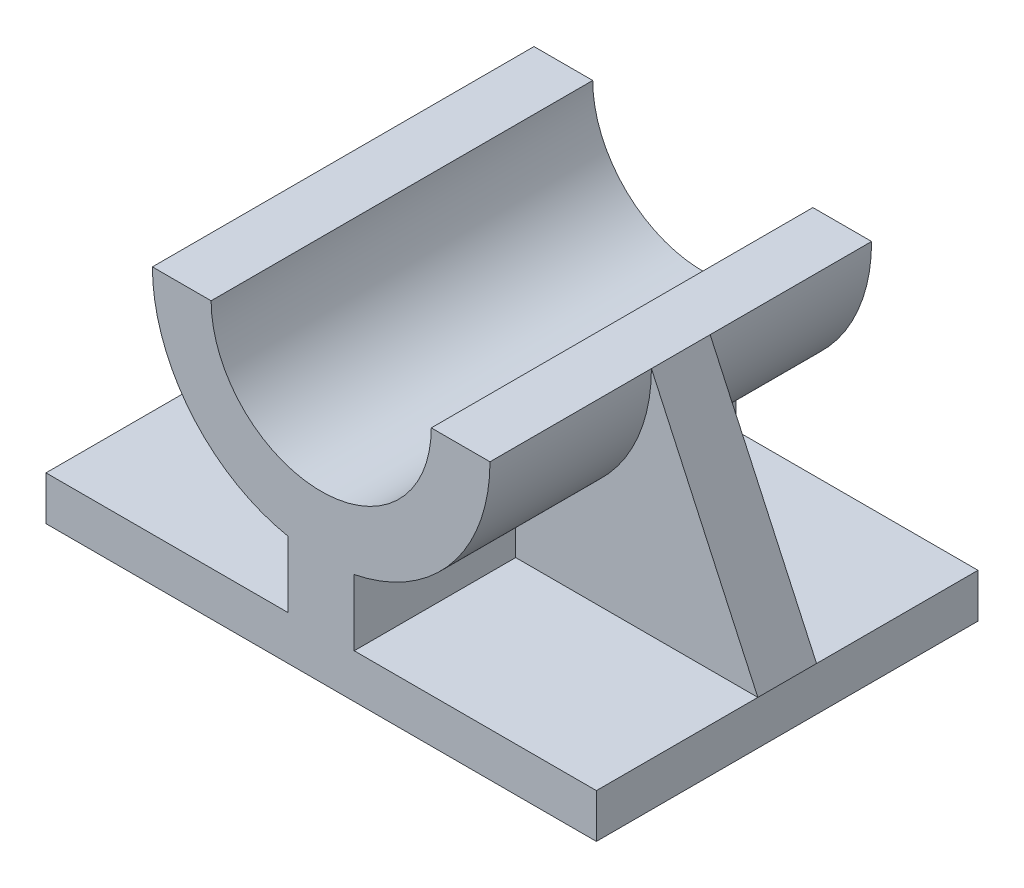
ISO-10303-21;
HEADER;
FILE_DESCRIPTION(('STEP AP214'),'2;1');
FILE_NAME('part.step','',(''),(''),'','','');
FILE_SCHEMA(('AUTOMOTIVE_DESIGN { 1 0 10303 214 1 1 1 1 }'));
ENDSEC;
DATA;
#1=APPLICATION_CONTEXT('core data for automotive mechanical design processes');
#2=APPLICATION_PROTOCOL_DEFINITION('international standard','automotive_design',2000,#1);
#3=PRODUCT_CONTEXT('',#1,'mechanical');
#4=PRODUCT('Part','Part','',(#3));
#5=PRODUCT_RELATED_PRODUCT_CATEGORY('part','',(#4));
#6=PRODUCT_DEFINITION_FORMATION('','',#4);
#7=PRODUCT_DEFINITION_CONTEXT('part definition',#1,'design');
#8=PRODUCT_DEFINITION('design','',#6,#7);
#9=PRODUCT_DEFINITION_SHAPE('','',#8);
#10=(LENGTH_UNIT() NAMED_UNIT(*) SI_UNIT(.MILLI.,.METRE.));
#11=(NAMED_UNIT(*) PLANE_ANGLE_UNIT() SI_UNIT($,.RADIAN.));
#12=(NAMED_UNIT(*) SI_UNIT($,.STERADIAN.) SOLID_ANGLE_UNIT());
#13=UNCERTAINTY_MEASURE_WITH_UNIT(LENGTH_MEASURE(1.E-05),#10,'distance_accuracy_value','');
#14=(GEOMETRIC_REPRESENTATION_CONTEXT(3) GLOBAL_UNCERTAINTY_ASSIGNED_CONTEXT((#13)) GLOBAL_UNIT_ASSIGNED_CONTEXT((#10,
#11,#12)) REPRESENTATION_CONTEXT('',''));
#15=CARTESIAN_POINT('',(0.,0.,0.));
#16=DIRECTION('',(0.,0.,1.));
#17=DIRECTION('',(1.,0.,0.));
#18=AXIS2_PLACEMENT_3D('',#15,#16,#17);
#19=CARTESIAN_POINT('',(0.,-31.5554871372799,-26.));
#20=DIRECTION('',(0.,-1.,0.));
#21=DIRECTION('',(1.,0.,0.));
#22=AXIS2_PLACEMENT_3D('',#19,#20,#21);
#23=PLANE('',#22);
#24=DIRECTION('',(-1.,0.,0.));
#25=VECTOR('',#24,1.);
#26=CARTESIAN_POINT('',(0.,-31.5554871372799,-4.));
#27=LINE('',#26,#25);
#28=CARTESIAN_POINT('',(-4.49999999999999,-31.5554871372799,-4.));
#29=VERTEX_POINT('',#28);
#30=CARTESIAN_POINT('',(-37.5,-31.5554871372799,-4.));
#31=VERTEX_POINT('',#30);
#32=EDGE_CURVE('E196',#29,#31,#27,.T.);
#33=ORIENTED_EDGE('',*,*,#32,.F.);
#34=DIRECTION('',(0.,0.,1.));
#35=VECTOR('',#34,1.);
#36=CARTESIAN_POINT('',(-4.49999999999999,-31.5554871372799,-26.));
#37=LINE('',#36,#35);
#38=CARTESIAN_POINT('',(-4.49999999999999,-31.5554871372799,-26.));
#39=VERTEX_POINT('',#38);
#40=EDGE_CURVE('E328',#39,#29,#37,.T.);
#41=ORIENTED_EDGE('',*,*,#40,.F.);
#42=DIRECTION('',(1.,0.,0.));
#43=VECTOR('',#42,1.);
#44=CARTESIAN_POINT('',(0.,-31.5554871372799,-26.));
#45=LINE('',#44,#43);
#46=CARTESIAN_POINT('',(-37.5,-31.5554871372799,-26.));
#47=VERTEX_POINT('',#46);
#48=EDGE_CURVE('E267',#47,#39,#45,.T.);
#49=ORIENTED_EDGE('',*,*,#48,.F.);
#50=DIRECTION('',(0.,0.,1.));
#51=VECTOR('',#50,1.);
#52=CARTESIAN_POINT('',(-37.5,-31.5554871372799,-26.));
#53=LINE('',#52,#51);
#54=EDGE_CURVE('E51',#47,#31,#53,.T.);
#55=ORIENTED_EDGE('',*,*,#54,.T.);
#56=EDGE_LOOP('',(#33,#41,#49,#55));
#57=FACE_BOUND('',#56,.T.);
#58=ADVANCED_FACE('F41',(#57),#23,.F.);
#59=CARTESIAN_POINT('',(-4.49999999999994,0.,-26.));
#60=DIRECTION('',(1.,0.,0.));
#61=DIRECTION('',(0.,1.,0.));
#62=AXIS2_PLACEMENT_3D('',#59,#60,#61);
#63=PLANE('',#62);
#64=DIRECTION('',(0.,-1.,0.));
#65=VECTOR('',#64,1.);
#66=CARTESIAN_POINT('',(-4.49999999999994,0.,-4.));
#67=LINE('',#66,#65);
#68=CARTESIAN_POINT('',(-4.49999999999998,-22.5554871372799,-4.));
#69=VERTEX_POINT('',#68);
#70=EDGE_CURVE('E208',#69,#29,#67,.T.);
#71=ORIENTED_EDGE('',*,*,#70,.F.);
#72=DIRECTION('',(0.,0.,1.));
#73=VECTOR('',#72,1.);
#74=CARTESIAN_POINT('',(-4.49999999999998,-22.5554871372799,-26.));
#75=LINE('',#74,#73);
#76=CARTESIAN_POINT('',(-4.49999999999998,-22.5554871372799,-26.));
#77=VERTEX_POINT('',#76);
#78=EDGE_CURVE('E205',#77,#69,#75,.T.);
#79=ORIENTED_EDGE('',*,*,#78,.F.);
#80=DIRECTION('',(0.,1.,0.));
#81=VECTOR('',#80,1.);
#82=CARTESIAN_POINT('',(-4.49999999999994,0.,-26.));
#83=LINE('',#82,#81);
#84=EDGE_CURVE('E273',#39,#77,#83,.T.);
#85=ORIENTED_EDGE('',*,*,#84,.F.);
#86=ORIENTED_EDGE('',*,*,#40,.T.);
#87=EDGE_LOOP('',(#71,#79,#85,#86));
#88=FACE_BOUND('',#87,.T.);
#89=ADVANCED_FACE('F427',(#88),#63,.F.);
#90=CARTESIAN_POINT('',(0.,0.,-26.));
#91=DIRECTION('',(0.,0.,1.));
#92=DIRECTION('',(1.,0.,0.));
#93=AXIS2_PLACEMENT_3D('',#90,#91,#92);
#94=CYLINDRICAL_SURFACE('',#93,23.);
#95=ORIENTED_EDGE('',*,*,#78,.T.);
#96=CARTESIAN_POINT('',(0.,0.,-4.));
#97=DIRECTION('',(0.,0.,1.));
#98=DIRECTION('',(1.,0.,0.));
#99=AXIS2_PLACEMENT_3D('',#96,#97,#98);
#100=CIRCLE('',#99,23.);
#101=CARTESIAN_POINT('',(-23.,0.,-4.));
#102=VERTEX_POINT('',#101);
#103=EDGE_CURVE('E193',#69,#102,#100,.F.);
#104=ORIENTED_EDGE('',*,*,#103,.T.);
#105=DIRECTION('',(0.,0.,1.));
#106=VECTOR('',#105,1.);
#107=CARTESIAN_POINT('',(-23.,0.,-26.));
#108=LINE('',#107,#106);
#109=CARTESIAN_POINT('',(-23.,0.,-26.));
#110=VERTEX_POINT('',#109);
#111=EDGE_CURVE('E187',#110,#102,#108,.T.);
#112=ORIENTED_EDGE('',*,*,#111,.F.);
#113=CARTESIAN_POINT('',(0.,0.,-26.));
#114=DIRECTION('',(0.,0.,1.));
#115=DIRECTION('',(1.,0.,0.));
#116=AXIS2_PLACEMENT_3D('',#113,#114,#115);
#117=CIRCLE('',#116,23.);
#118=EDGE_CURVE('E419',#110,#77,#117,.T.);
#119=ORIENTED_EDGE('',*,*,#118,.T.);
#120=EDGE_LOOP('',(#95,#104,#112,#119));
#121=FACE_BOUND('',#120,.T.);
#122=ADVANCED_FACE('F201',(#121),#94,.T.);
#123=CARTESIAN_POINT('',(0.,0.,-26.));
#124=DIRECTION('',(0.,0.,1.));
#125=DIRECTION('',(1.,0.,0.));
#126=AXIS2_PLACEMENT_3D('',#123,#124,#125);
#127=CYLINDRICAL_SURFACE('',#126,23.);
#128=DIRECTION('',(0.,0.,1.));
#129=VECTOR('',#128,1.);
#130=CARTESIAN_POINT('',(23.,0.,-26.));
#131=LINE('',#130,#129);
#132=CARTESIAN_POINT('',(23.,0.,-26.));
#133=VERTEX_POINT('',#132);
#134=CARTESIAN_POINT('',(23.,0.,-4.));
#135=VERTEX_POINT('',#134);
#136=EDGE_CURVE('E230',#133,#135,#131,.T.);
#137=ORIENTED_EDGE('',*,*,#136,.T.);
#138=CARTESIAN_POINT('',(0.,0.,-4.));
#139=DIRECTION('',(0.,0.,1.));
#140=DIRECTION('',(1.,0.,0.));
#141=AXIS2_PLACEMENT_3D('',#138,#139,#140);
#142=CIRCLE('',#141,23.);
#143=CARTESIAN_POINT('',(4.49999999999999,-22.5554871372799,-4.));
#144=VERTEX_POINT('',#143);
#145=EDGE_CURVE('E379',#135,#144,#142,.F.);
#146=ORIENTED_EDGE('',*,*,#145,.T.);
#147=DIRECTION('',(0.,0.,1.));
#148=VECTOR('',#147,1.);
#149=CARTESIAN_POINT('',(4.49999999999999,-22.5554871372799,-26.));
#150=LINE('',#149,#148);
#151=CARTESIAN_POINT('',(4.49999999999999,-22.5554871372799,-26.));
#152=VERTEX_POINT('',#151);
#153=EDGE_CURVE('E237',#152,#144,#150,.T.);
#154=ORIENTED_EDGE('',*,*,#153,.F.);
#155=CARTESIAN_POINT('',(0.,0.,-26.));
#156=DIRECTION('',(0.,0.,1.));
#157=DIRECTION('',(1.,0.,0.));
#158=AXIS2_PLACEMENT_3D('',#155,#156,#157);
#159=CIRCLE('',#158,23.);
#160=EDGE_CURVE('E407',#152,#133,#159,.T.);
#161=ORIENTED_EDGE('',*,*,#160,.T.);
#162=EDGE_LOOP('',(#137,#146,#154,#161));
#163=FACE_BOUND('',#162,.T.);
#164=ADVANCED_FACE('F567',(#163),#127,.T.);
#165=CARTESIAN_POINT('',(4.49999999999996,0.,-26.));
#166=DIRECTION('',(1.,0.,0.));
#167=DIRECTION('',(0.,1.,0.));
#168=AXIS2_PLACEMENT_3D('',#165,#166,#167);
#169=PLANE('',#168);
#170=ORIENTED_EDGE('',*,*,#153,.T.);
#171=DIRECTION('',(0.,-1.,0.));
#172=VECTOR('',#171,1.);
#173=CARTESIAN_POINT('',(4.49999999999996,0.,-4.));
#174=LINE('',#173,#172);
#175=CARTESIAN_POINT('',(4.5,-31.5554871372799,-4.));
#176=VERTEX_POINT('',#175);
#177=EDGE_CURVE('E375',#144,#176,#174,.T.);
#178=ORIENTED_EDGE('',*,*,#177,.T.);
#179=DIRECTION('',(0.,0.,1.));
#180=VECTOR('',#179,1.);
#181=CARTESIAN_POINT('',(4.5,-31.5554871372799,-26.));
#182=LINE('',#181,#180);
#183=CARTESIAN_POINT('',(4.5,-31.5554871372799,-26.));
#184=VERTEX_POINT('',#183);
#185=EDGE_CURVE('E242',#184,#176,#182,.T.);
#186=ORIENTED_EDGE('',*,*,#185,.F.);
#187=DIRECTION('',(0.,1.,0.));
#188=VECTOR('',#187,1.);
#189=CARTESIAN_POINT('',(4.49999999999996,0.,-26.));
#190=LINE('',#189,#188);
#191=EDGE_CURVE('E403',#184,#152,#190,.T.);
#192=ORIENTED_EDGE('',*,*,#191,.T.);
#193=EDGE_LOOP('',(#170,#178,#186,#192));
#194=FACE_BOUND('',#193,.T.);
#195=ADVANCED_FACE('F561',(#194),#169,.T.);
#196=CARTESIAN_POINT('',(0.,-31.5554871372799,-26.));
#197=DIRECTION('',(0.,1.,0.));
#198=DIRECTION('',(-1.,0.,0.));
#199=AXIS2_PLACEMENT_3D('',#196,#197,#198);
#200=PLANE('',#199);
#201=ORIENTED_EDGE('',*,*,#185,.T.);
#202=DIRECTION('',(1.,0.,0.));
#203=VECTOR('',#202,1.);
#204=CARTESIAN_POINT('',(0.,-31.5554871372799,-4.));
#205=LINE('',#204,#203);
#206=CARTESIAN_POINT('',(37.5,-31.5554871372799,-4.));
#207=VERTEX_POINT('',#206);
#208=EDGE_CURVE('E368',#176,#207,#205,.T.);
#209=ORIENTED_EDGE('',*,*,#208,.T.);
#210=DIRECTION('',(0.,0.,1.));
#211=VECTOR('',#210,1.);
#212=CARTESIAN_POINT('',(37.5,-31.5554871372799,-26.));
#213=LINE('',#212,#211);
#214=CARTESIAN_POINT('',(37.5,-31.5554871372799,-26.));
#215=VERTEX_POINT('',#214);
#216=EDGE_CURVE('E246',#215,#207,#213,.T.);
#217=ORIENTED_EDGE('',*,*,#216,.F.);
#218=DIRECTION('',(-1.,0.,0.));
#219=VECTOR('',#218,1.);
#220=CARTESIAN_POINT('',(0.,-31.5554871372799,-26.));
#221=LINE('',#220,#219);
#222=EDGE_CURVE('E399',#215,#184,#221,.T.);
#223=ORIENTED_EDGE('',*,*,#222,.T.);
#224=EDGE_LOOP('',(#201,#209,#217,#223));
#225=FACE_BOUND('',#224,.T.);
#226=ADVANCED_FACE('F488',(#225),#200,.T.);
#227=CARTESIAN_POINT('',(0.,-37.5554871372799,-26.));
#228=DIRECTION('',(0.,1.,0.));
#229=DIRECTION('',(-1.,0.,0.));
#230=AXIS2_PLACEMENT_3D('',#227,#228,#229);
#231=PLANE('',#230);
#232=DIRECTION('',(-1.,0.,0.));
#233=VECTOR('',#232,1.);
#234=CARTESIAN_POINT('',(0.,-37.5554871372799,26.));
#235=LINE('',#234,#233);
#236=CARTESIAN_POINT('',(37.5,-37.5554871372799,26.));
#237=VERTEX_POINT('',#236);
#238=CARTESIAN_POINT('',(-37.5,-37.5554871372799,26.));
#239=VERTEX_POINT('',#238);
#240=EDGE_CURVE('E277',#237,#239,#235,.T.);
#241=ORIENTED_EDGE('',*,*,#240,.T.);
#242=DIRECTION('',(0.,0.,1.));
#243=VECTOR('',#242,1.);
#244=CARTESIAN_POINT('',(-37.5,-37.5554871372799,-26.));
#245=LINE('',#244,#243);
#246=CARTESIAN_POINT('',(-37.5,-37.5554871372799,-26.));
#247=VERTEX_POINT('',#246);
#248=EDGE_CURVE('E11',#247,#239,#245,.T.);
#249=ORIENTED_EDGE('',*,*,#248,.F.);
#250=DIRECTION('',(-1.,0.,0.));
#251=VECTOR('',#250,1.);
#252=CARTESIAN_POINT('',(0.,-37.5554871372799,-26.));
#253=LINE('',#252,#251);
#254=CARTESIAN_POINT('',(37.5,-37.5554871372799,-26.));
#255=VERTEX_POINT('',#254);
#256=EDGE_CURVE('E322',#255,#247,#253,.T.);
#257=ORIENTED_EDGE('',*,*,#256,.F.);
#258=DIRECTION('',(0.,0.,1.));
#259=VECTOR('',#258,1.);
#260=CARTESIAN_POINT('',(37.5,-37.5554871372799,-26.));
#261=LINE('',#260,#259);
#262=EDGE_CURVE('E45',#255,#237,#261,.T.);
#263=ORIENTED_EDGE('',*,*,#262,.T.);
#264=EDGE_LOOP('',(#241,#249,#257,#263));
#265=FACE_BOUND('',#264,.T.);
#266=ADVANCED_FACE('F43',(#265),#231,.F.);
#267=CARTESIAN_POINT('',(-37.5,0.,-26.));
#268=DIRECTION('',(1.,0.,0.));
#269=DIRECTION('',(0.,0.,-1.));
#270=AXIS2_PLACEMENT_3D('',#267,#268,#269);
#271=PLANE('',#270);
#272=CARTESIAN_POINT('',(-37.5,-31.5554871372799,4.));
#273=VERTEX_POINT('',#272);
#274=CARTESIAN_POINT('',(-37.5,-31.5554871372799,26.));
#275=VERTEX_POINT('',#274);
#276=EDGE_CURVE('E327',#273,#275,#53,.T.);
#277=ORIENTED_EDGE('',*,*,#276,.F.);
#278=DIRECTION('',(0.,0.,-1.));
#279=VECTOR('',#278,1.);
#280=CARTESIAN_POINT('',(-37.5,-31.5554871372799,-26.));
#281=LINE('',#280,#279);
#282=EDGE_CURVE('E357',#273,#31,#281,.T.);
#283=ORIENTED_EDGE('',*,*,#282,.T.);
#284=ORIENTED_EDGE('',*,*,#54,.F.);
#285=DIRECTION('',(0.,1.,0.));
#286=VECTOR('',#285,1.);
#287=CARTESIAN_POINT('',(-37.5,0.,-26.));
#288=LINE('',#287,#286);
#289=EDGE_CURVE('E261',#247,#47,#288,.T.);
#290=ORIENTED_EDGE('',*,*,#289,.F.);
#291=ORIENTED_EDGE('',*,*,#248,.T.);
#292=DIRECTION('',(0.,1.,0.));
#293=VECTOR('',#292,1.);
#294=CARTESIAN_POINT('',(-37.5,0.,26.));
#295=LINE('',#294,#293);
#296=EDGE_CURVE('E319',#239,#275,#295,.T.);
#297=ORIENTED_EDGE('',*,*,#296,.T.);
#298=EDGE_LOOP('',(#277,#283,#284,#290,#291,#297));
#299=FACE_BOUND('',#298,.T.);
#300=ADVANCED_FACE('F434',(#299),#271,.F.);
#301=CARTESIAN_POINT('',(-4.49999999999999,-31.5554871372799,4.));
#302=VERTEX_POINT('',#301);
#303=CARTESIAN_POINT('',(-4.49999999999999,-31.5554871372799,26.));
#304=VERTEX_POINT('',#303);
#305=EDGE_CURVE('E331',#302,#304,#37,.T.);
#306=ORIENTED_EDGE('',*,*,#305,.F.);
#307=DIRECTION('',(-1.,0.,0.));
#308=VECTOR('',#307,1.);
#309=CARTESIAN_POINT('',(0.,-31.5554871372799,4.));
#310=LINE('',#309,#308);
#311=EDGE_CURVE('E207',#302,#273,#310,.T.);
#312=ORIENTED_EDGE('',*,*,#311,.T.);
#313=ORIENTED_EDGE('',*,*,#276,.T.);
#314=DIRECTION('',(1.,0.,0.));
#315=VECTOR('',#314,1.);
#316=CARTESIAN_POINT('',(0.,-31.5554871372799,26.));
#317=LINE('',#316,#315);
#318=EDGE_CURVE('E315',#275,#304,#317,.T.);
#319=ORIENTED_EDGE('',*,*,#318,.T.);
#320=EDGE_LOOP('',(#306,#312,#313,#319));
#321=FACE_BOUND('',#320,.T.);
#322=ADVANCED_FACE('F344',(#321),#23,.F.);
#323=CARTESIAN_POINT('',(-4.49999999999998,-22.5554871372799,4.));
#324=VERTEX_POINT('',#323);
#325=CARTESIAN_POINT('',(-4.49999999999998,-22.5554871372799,26.));
#326=VERTEX_POINT('',#325);
#327=EDGE_CURVE('E216',#324,#326,#75,.T.);
#328=ORIENTED_EDGE('',*,*,#327,.F.);
#329=DIRECTION('',(0.,-1.,0.));
#330=VECTOR('',#329,1.);
#331=CARTESIAN_POINT('',(-4.49999999999994,0.,4.));
#332=LINE('',#331,#330);
#333=EDGE_CURVE('E340',#324,#302,#332,.T.);
#334=ORIENTED_EDGE('',*,*,#333,.T.);
#335=ORIENTED_EDGE('',*,*,#305,.T.);
#336=DIRECTION('',(0.,1.,0.));
#337=VECTOR('',#336,1.);
#338=CARTESIAN_POINT('',(-4.49999999999994,0.,26.));
#339=LINE('',#338,#337);
#340=EDGE_CURVE('E311',#304,#326,#339,.T.);
#341=ORIENTED_EDGE('',*,*,#340,.T.);
#342=EDGE_LOOP('',(#328,#334,#335,#341));
#343=FACE_BOUND('',#342,.T.);
#344=ADVANCED_FACE('F338',(#343),#63,.F.);
#345=CARTESIAN_POINT('',(0.,0.,4.));
#346=DIRECTION('',(0.,0.,1.));
#347=DIRECTION('',(1.,0.,0.));
#348=AXIS2_PLACEMENT_3D('',#345,#346,#347);
#349=CIRCLE('',#348,23.);
#350=CARTESIAN_POINT('',(-23.,0.,3.99999999999999));
#351=VERTEX_POINT('',#350);
#352=EDGE_CURVE('E354',#324,#351,#349,.F.);
#353=ORIENTED_EDGE('',*,*,#352,.F.);
#354=ORIENTED_EDGE('',*,*,#327,.T.);
#355=CARTESIAN_POINT('',(0.,0.,26.));
#356=DIRECTION('',(0.,0.,1.));
#357=DIRECTION('',(1.,0.,0.));
#358=AXIS2_PLACEMENT_3D('',#355,#356,#357);
#359=CIRCLE('',#358,23.);
#360=CARTESIAN_POINT('',(-23.,0.,26.));
#361=VERTEX_POINT('',#360);
#362=EDGE_CURVE('E307',#361,#326,#359,.T.);
#363=ORIENTED_EDGE('',*,*,#362,.F.);
#364=EDGE_CURVE('E188',#351,#361,#108,.T.);
#365=ORIENTED_EDGE('',*,*,#364,.F.);
#366=EDGE_LOOP('',(#353,#354,#363,#365));
#367=FACE_BOUND('',#366,.T.);
#368=ADVANCED_FACE('F353',(#367),#94,.T.);
#369=CARTESIAN_POINT('',(0.,0.,-26.));
#370=DIRECTION('',(0.,-1.,0.));
#371=DIRECTION('',(0.,0.,-1.));
#372=AXIS2_PLACEMENT_3D('',#369,#370,#371);
#373=PLANE('',#372);
#374=DIRECTION('',(1.,0.,0.));
#375=VECTOR('',#374,1.);
#376=CARTESIAN_POINT('',(0.,0.,26.));
#377=LINE('',#376,#375);
#378=CARTESIAN_POINT('',(-15.,0.,26.));
#379=VERTEX_POINT('',#378);
#380=EDGE_CURVE('E304',#361,#379,#377,.T.);
#381=ORIENTED_EDGE('',*,*,#380,.T.);
#382=DIRECTION('',(0.,0.,1.));
#383=VECTOR('',#382,1.);
#384=CARTESIAN_POINT('',(-15.,0.,-26.));
#385=LINE('',#384,#383);
#386=CARTESIAN_POINT('',(-15.,0.,-26.));
#387=VERTEX_POINT('',#386);
#388=EDGE_CURVE('E221',#387,#379,#385,.T.);
#389=ORIENTED_EDGE('',*,*,#388,.F.);
#390=DIRECTION('',(1.,0.,0.));
#391=VECTOR('',#390,1.);
#392=CARTESIAN_POINT('',(0.,0.,-26.));
#393=LINE('',#392,#391);
#394=EDGE_CURVE('E213',#110,#387,#393,.T.);
#395=ORIENTED_EDGE('',*,*,#394,.F.);
#396=ORIENTED_EDGE('',*,*,#111,.T.);
#397=EDGE_CURVE('E179',#102,#351,#108,.T.);
#398=ORIENTED_EDGE('',*,*,#397,.T.);
#399=ORIENTED_EDGE('',*,*,#364,.T.);
#400=EDGE_LOOP('',(#381,#389,#395,#396,#398,#399));
#401=FACE_BOUND('',#400,.T.);
#402=ADVANCED_FACE('F211',(#401),#373,.F.);
#403=CARTESIAN_POINT('',(0.,0.,-26.));
#404=DIRECTION('',(0.,0.,1.));
#405=DIRECTION('',(1.,0.,0.));
#406=AXIS2_PLACEMENT_3D('',#403,#404,#405);
#407=CYLINDRICAL_SURFACE('',#406,15.);
#408=CARTESIAN_POINT('',(0.,0.,26.));
#409=DIRECTION('',(0.,0.,1.));
#410=DIRECTION('',(1.,0.,0.));
#411=AXIS2_PLACEMENT_3D('',#408,#409,#410);
#412=CIRCLE('',#411,15.);
#413=CARTESIAN_POINT('',(15.,0.,26.));
#414=VERTEX_POINT('',#413);
#415=EDGE_CURVE('E301',#379,#414,#412,.T.);
#416=ORIENTED_EDGE('',*,*,#415,.T.);
#417=DIRECTION('',(0.,0.,1.));
#418=VECTOR('',#417,1.);
#419=CARTESIAN_POINT('',(15.,0.,-26.));
#420=LINE('',#419,#418);
#421=CARTESIAN_POINT('',(15.,0.,-26.));
#422=VERTEX_POINT('',#421);
#423=EDGE_CURVE('E225',#422,#414,#420,.T.);
#424=ORIENTED_EDGE('',*,*,#423,.F.);
#425=CARTESIAN_POINT('',(0.,0.,-26.));
#426=DIRECTION('',(0.,0.,1.));
#427=DIRECTION('',(1.,0.,0.));
#428=AXIS2_PLACEMENT_3D('',#425,#426,#427);
#429=CIRCLE('',#428,15.);
#430=EDGE_CURVE('E414',#387,#422,#429,.T.);
#431=ORIENTED_EDGE('',*,*,#430,.F.);
#432=ORIENTED_EDGE('',*,*,#388,.T.);
#433=EDGE_LOOP('',(#416,#424,#431,#432));
#434=FACE_BOUND('',#433,.T.);
#435=ADVANCED_FACE('F463',(#434),#407,.F.);
#436=CARTESIAN_POINT('',(0.,0.,-26.));
#437=DIRECTION('',(0.,-1.,0.));
#438=DIRECTION('',(0.,0.,-1.));
#439=AXIS2_PLACEMENT_3D('',#436,#437,#438);
#440=PLANE('',#439);
#441=CARTESIAN_POINT('',(23.,0.,4.));
#442=VERTEX_POINT('',#441);
#443=CARTESIAN_POINT('',(23.,0.,26.));
#444=VERTEX_POINT('',#443);
#445=EDGE_CURVE('E236',#442,#444,#131,.T.);
#446=ORIENTED_EDGE('',*,*,#445,.F.);
#447=DIRECTION('',(0.,0.,1.));
#448=VECTOR('',#447,1.);
#449=CARTESIAN_POINT('',(23.,0.,-26.));
#450=LINE('',#449,#448);
#451=EDGE_CURVE('E281',#135,#442,#450,.T.);
#452=ORIENTED_EDGE('',*,*,#451,.F.);
#453=ORIENTED_EDGE('',*,*,#136,.F.);
#454=DIRECTION('',(1.,0.,0.));
#455=VECTOR('',#454,1.);
#456=CARTESIAN_POINT('',(0.,0.,-26.));
#457=LINE('',#456,#455);
#458=EDGE_CURVE('E411',#422,#133,#457,.T.);
#459=ORIENTED_EDGE('',*,*,#458,.F.);
#460=ORIENTED_EDGE('',*,*,#423,.T.);
#461=DIRECTION('',(1.,0.,0.));
#462=VECTOR('',#461,1.);
#463=CARTESIAN_POINT('',(0.,0.,26.));
#464=LINE('',#463,#462);
#465=EDGE_CURVE('E297',#414,#444,#464,.T.);
#466=ORIENTED_EDGE('',*,*,#465,.T.);
#467=EDGE_LOOP('',(#446,#452,#453,#459,#460,#466));
#468=FACE_BOUND('',#467,.T.);
#469=ADVANCED_FACE('F458',(#468),#440,.F.);
#470=CARTESIAN_POINT('',(0.,0.,4.));
#471=DIRECTION('',(0.,0.,1.));
#472=DIRECTION('',(1.,0.,0.));
#473=AXIS2_PLACEMENT_3D('',#470,#471,#472);
#474=CIRCLE('',#473,23.);
#475=CARTESIAN_POINT('',(4.49999999999999,-22.5554871372799,4.));
#476=VERTEX_POINT('',#475);
#477=EDGE_CURVE('E389',#442,#476,#474,.F.);
#478=ORIENTED_EDGE('',*,*,#477,.F.);
#479=ORIENTED_EDGE('',*,*,#445,.T.);
#480=CARTESIAN_POINT('',(0.,0.,26.));
#481=DIRECTION('',(0.,0.,1.));
#482=DIRECTION('',(1.,0.,0.));
#483=AXIS2_PLACEMENT_3D('',#480,#481,#482);
#484=CIRCLE('',#483,23.);
#485=CARTESIAN_POINT('',(4.49999999999999,-22.5554871372799,26.));
#486=VERTEX_POINT('',#485);
#487=EDGE_CURVE('E293',#486,#444,#484,.T.);
#488=ORIENTED_EDGE('',*,*,#487,.F.);
#489=EDGE_CURVE('E241',#476,#486,#150,.T.);
#490=ORIENTED_EDGE('',*,*,#489,.F.);
#491=EDGE_LOOP('',(#478,#479,#488,#490));
#492=FACE_BOUND('',#491,.T.);
#493=ADVANCED_FACE('F454',(#492),#127,.T.);
#494=DIRECTION('',(0.,-1.,0.));
#495=VECTOR('',#494,1.);
#496=CARTESIAN_POINT('',(4.49999999999996,0.,4.));
#497=LINE('',#496,#495);
#498=CARTESIAN_POINT('',(4.5,-31.5554871372799,4.));
#499=VERTEX_POINT('',#498);
#500=EDGE_CURVE('E386',#476,#499,#497,.T.);
#501=ORIENTED_EDGE('',*,*,#500,.F.);
#502=ORIENTED_EDGE('',*,*,#489,.T.);
#503=DIRECTION('',(0.,1.,0.));
#504=VECTOR('',#503,1.);
#505=CARTESIAN_POINT('',(4.49999999999996,0.,26.));
#506=LINE('',#505,#504);
#507=CARTESIAN_POINT('',(4.5,-31.5554871372799,26.));
#508=VERTEX_POINT('',#507);
#509=EDGE_CURVE('E289',#508,#486,#506,.T.);
#510=ORIENTED_EDGE('',*,*,#509,.F.);
#511=EDGE_CURVE('E245',#499,#508,#182,.T.);
#512=ORIENTED_EDGE('',*,*,#511,.F.);
#513=EDGE_LOOP('',(#501,#502,#510,#512));
#514=FACE_BOUND('',#513,.T.);
#515=ADVANCED_FACE('F448',(#514),#169,.T.);
#516=DIRECTION('',(1.,0.,0.));
#517=VECTOR('',#516,1.);
#518=CARTESIAN_POINT('',(0.,-31.5554871372799,4.));
#519=LINE('',#518,#517);
#520=CARTESIAN_POINT('',(37.5,-31.5554871372799,3.99999999999999));
#521=VERTEX_POINT('',#520);
#522=EDGE_CURVE('E383',#499,#521,#519,.T.);
#523=ORIENTED_EDGE('',*,*,#522,.F.);
#524=ORIENTED_EDGE('',*,*,#511,.T.);
#525=DIRECTION('',(-1.,0.,0.));
#526=VECTOR('',#525,1.);
#527=CARTESIAN_POINT('',(0.,-31.5554871372799,26.));
#528=LINE('',#527,#526);
#529=CARTESIAN_POINT('',(37.5,-31.5554871372799,26.));
#530=VERTEX_POINT('',#529);
#531=EDGE_CURVE('E285',#530,#508,#528,.T.);
#532=ORIENTED_EDGE('',*,*,#531,.F.);
#533=EDGE_CURVE('E250',#521,#530,#213,.T.);
#534=ORIENTED_EDGE('',*,*,#533,.F.);
#535=EDGE_LOOP('',(#523,#524,#532,#534));
#536=FACE_BOUND('',#535,.T.);
#537=ADVANCED_FACE('F444',(#536),#200,.T.);
#538=CARTESIAN_POINT('',(37.5,0.,-26.));
#539=DIRECTION('',(1.,0.,0.));
#540=DIRECTION('',(0.,0.,-1.));
#541=AXIS2_PLACEMENT_3D('',#538,#539,#540);
#542=PLANE('',#541);
#543=DIRECTION('',(0.,1.,0.));
#544=VECTOR('',#543,1.);
#545=CARTESIAN_POINT('',(37.5,0.,26.));
#546=LINE('',#545,#544);
#547=EDGE_CURVE('E280',#237,#530,#546,.T.);
#548=ORIENTED_EDGE('',*,*,#547,.F.);
#549=ORIENTED_EDGE('',*,*,#262,.F.);
#550=DIRECTION('',(0.,1.,0.));
#551=VECTOR('',#550,1.);
#552=CARTESIAN_POINT('',(37.5,0.,-26.));
#553=LINE('',#552,#551);
#554=EDGE_CURVE('E396',#255,#215,#553,.T.);
#555=ORIENTED_EDGE('',*,*,#554,.T.);
#556=ORIENTED_EDGE('',*,*,#216,.T.);
#557=EDGE_CURVE('E249',#207,#521,#213,.T.);
#558=ORIENTED_EDGE('',*,*,#557,.T.);
#559=ORIENTED_EDGE('',*,*,#533,.T.);
#560=EDGE_LOOP('',(#548,#549,#555,#556,#558,#559));
#561=FACE_BOUND('',#560,.T.);
#562=ADVANCED_FACE('F440',(#561),#542,.T.);
#563=CARTESIAN_POINT('',(0.,0.,-26.));
#564=DIRECTION('',(0.,0.,1.));
#565=DIRECTION('',(1.,0.,0.));
#566=AXIS2_PLACEMENT_3D('',#563,#564,#565);
#567=PLANE('',#566);
#568=ORIENTED_EDGE('',*,*,#256,.T.);
#569=ORIENTED_EDGE('',*,*,#289,.T.);
#570=ORIENTED_EDGE('',*,*,#48,.T.);
#571=ORIENTED_EDGE('',*,*,#84,.T.);
#572=ORIENTED_EDGE('',*,*,#118,.F.);
#573=ORIENTED_EDGE('',*,*,#394,.T.);
#574=ORIENTED_EDGE('',*,*,#430,.T.);
#575=ORIENTED_EDGE('',*,*,#458,.T.);
#576=ORIENTED_EDGE('',*,*,#160,.F.);
#577=ORIENTED_EDGE('',*,*,#191,.F.);
#578=ORIENTED_EDGE('',*,*,#222,.F.);
#579=ORIENTED_EDGE('',*,*,#554,.F.);
#580=EDGE_LOOP('',(#568,#569,#570,#571,#572,#573,#574,#575,#576,#577,#578,#579));
#581=FACE_BOUND('',#580,.T.);
#582=ADVANCED_FACE('F423',(#581),#567,.F.);
#583=CARTESIAN_POINT('',(0.,0.,26.));
#584=DIRECTION('',(0.,0.,1.));
#585=DIRECTION('',(1.,0.,0.));
#586=AXIS2_PLACEMENT_3D('',#583,#584,#585);
#587=PLANE('',#586);
#588=ORIENTED_EDGE('',*,*,#240,.F.);
#589=ORIENTED_EDGE('',*,*,#547,.T.);
#590=ORIENTED_EDGE('',*,*,#531,.T.);
#591=ORIENTED_EDGE('',*,*,#509,.T.);
#592=ORIENTED_EDGE('',*,*,#487,.T.);
#593=ORIENTED_EDGE('',*,*,#465,.F.);
#594=ORIENTED_EDGE('',*,*,#415,.F.);
#595=ORIENTED_EDGE('',*,*,#380,.F.);
#596=ORIENTED_EDGE('',*,*,#362,.T.);
#597=ORIENTED_EDGE('',*,*,#340,.F.);
#598=ORIENTED_EDGE('',*,*,#318,.F.);
#599=ORIENTED_EDGE('',*,*,#296,.F.);
#600=EDGE_LOOP('',(#588,#589,#590,#591,#592,#593,#594,#595,#596,#597,#598,#599));
#601=FACE_BOUND('',#600,.T.);
#602=ADVANCED_FACE('F348',(#601),#587,.T.);
#603=CARTESIAN_POINT('',(23.,0.,0.));
#604=DIRECTION('',(-0.908660097005387,-0.41753661888529,0.));
#605=DIRECTION('',(0.41753661888529,-0.908660097005387,0.));
#606=AXIS2_PLACEMENT_3D('',#603,#604,#605);
#607=PLANE('',#606);
#608=DIRECTION('',(0.41753661888529,-0.908660097005387,0.));
#609=VECTOR('',#608,1.);
#610=CARTESIAN_POINT('',(23.,0.,-4.));
#611=LINE('',#610,#609);
#612=EDGE_CURVE('E361',#135,#207,#611,.T.);
#613=ORIENTED_EDGE('',*,*,#612,.F.);
#614=ORIENTED_EDGE('',*,*,#451,.T.);
#615=DIRECTION('',(0.41753661888529,-0.908660097005387,0.));
#616=VECTOR('',#615,1.);
#617=CARTESIAN_POINT('',(23.,0.,4.));
#618=LINE('',#617,#616);
#619=EDGE_CURVE('E67',#442,#521,#618,.T.);
#620=ORIENTED_EDGE('',*,*,#619,.T.);
#621=ORIENTED_EDGE('',*,*,#557,.F.);
#622=EDGE_LOOP('',(#613,#614,#620,#621));
#623=FACE_BOUND('',#622,.T.);
#624=ADVANCED_FACE('F492',(#623),#607,.F.);
#625=CARTESIAN_POINT('',(0.,-18.77774356864,4.));
#626=DIRECTION('',(0.,0.,1.));
#627=DIRECTION('',(1.,0.,0.));
#628=AXIS2_PLACEMENT_3D('',#625,#626,#627);
#629=PLANE('',#628);
#630=ORIENTED_EDGE('',*,*,#619,.F.);
#631=ORIENTED_EDGE('',*,*,#477,.T.);
#632=ORIENTED_EDGE('',*,*,#500,.T.);
#633=ORIENTED_EDGE('',*,*,#522,.T.);
#634=EDGE_LOOP('',(#630,#631,#632,#633));
#635=FACE_BOUND('',#634,.T.);
#636=ADVANCED_FACE('F497',(#635),#629,.T.);
#637=CARTESIAN_POINT('',(0.,-18.77774356864,-4.));
#638=DIRECTION('',(0.,0.,1.));
#639=DIRECTION('',(1.,0.,0.));
#640=AXIS2_PLACEMENT_3D('',#637,#638,#639);
#641=PLANE('',#640);
#642=ORIENTED_EDGE('',*,*,#145,.F.);
#643=ORIENTED_EDGE('',*,*,#612,.T.);
#644=ORIENTED_EDGE('',*,*,#208,.F.);
#645=ORIENTED_EDGE('',*,*,#177,.F.);
#646=EDGE_LOOP('',(#642,#643,#644,#645));
#647=FACE_BOUND('',#646,.T.);
#648=ADVANCED_FACE('F498',(#647),#641,.F.);
#649=CARTESIAN_POINT('',(-23.,0.,0.));
#650=DIRECTION('',(-0.908660097005387,0.41753661888529,0.));
#651=DIRECTION('',(-0.41753661888529,-0.908660097005387,0.));
#652=AXIS2_PLACEMENT_3D('',#649,#650,#651);
#653=PLANE('',#652);
#654=ORIENTED_EDGE('',*,*,#282,.F.);
#655=DIRECTION('',(-0.41753661888529,-0.908660097005387,0.));
#656=VECTOR('',#655,1.);
#657=CARTESIAN_POINT('',(-23.,0.,4.));
#658=LINE('',#657,#656);
#659=EDGE_CURVE('E59',#351,#273,#658,.T.);
#660=ORIENTED_EDGE('',*,*,#659,.F.);
#661=ORIENTED_EDGE('',*,*,#397,.F.);
#662=DIRECTION('',(-0.41753661888529,-0.908660097005387,0.));
#663=VECTOR('',#662,1.);
#664=CARTESIAN_POINT('',(-23.,0.,-4.));
#665=LINE('',#664,#663);
#666=EDGE_CURVE('E182',#102,#31,#665,.T.);
#667=ORIENTED_EDGE('',*,*,#666,.T.);
#668=EDGE_LOOP('',(#654,#660,#661,#667));
#669=FACE_BOUND('',#668,.T.);
#670=ADVANCED_FACE('F181',(#669),#653,.T.);
#671=CARTESIAN_POINT('',(0.,-18.77774356864,-4.));
#672=DIRECTION('',(0.,0.,1.));
#673=DIRECTION('',(1.,0.,0.));
#674=AXIS2_PLACEMENT_3D('',#671,#672,#673);
#675=PLANE('',#674);
#676=ORIENTED_EDGE('',*,*,#103,.F.);
#677=ORIENTED_EDGE('',*,*,#70,.T.);
#678=ORIENTED_EDGE('',*,*,#32,.T.);
#679=ORIENTED_EDGE('',*,*,#666,.F.);
#680=EDGE_LOOP('',(#676,#677,#678,#679));
#681=FACE_BOUND('',#680,.T.);
#682=ADVANCED_FACE('F192',(#681),#675,.F.);
#683=CARTESIAN_POINT('',(0.,-18.77774356864,4.));
#684=DIRECTION('',(0.,0.,1.));
#685=DIRECTION('',(1.,0.,0.));
#686=AXIS2_PLACEMENT_3D('',#683,#684,#685);
#687=PLANE('',#686);
#688=ORIENTED_EDGE('',*,*,#333,.F.);
#689=ORIENTED_EDGE('',*,*,#352,.T.);
#690=ORIENTED_EDGE('',*,*,#659,.T.);
#691=ORIENTED_EDGE('',*,*,#311,.F.);
#692=EDGE_LOOP('',(#688,#689,#690,#691));
#693=FACE_BOUND('',#692,.T.);
#694=ADVANCED_FACE('F509',(#693),#687,.T.);
#695=CLOSED_SHELL('',(#58,#89,#122,#164,#195,#226,#266,#300,#322,#344,#368,#402,#435,#469,#493,
#515,#537,#562,#582,#602,#624,#636,#648,#670,#682,#694));
#696=MANIFOLD_SOLID_BREP('B2',#695);
#697=ADVANCED_BREP_SHAPE_REPRESENTATION('',(#18,#696),#14);
#698=SHAPE_DEFINITION_REPRESENTATION(#9,#697);
ENDSEC;
END-ISO-10303-21;
